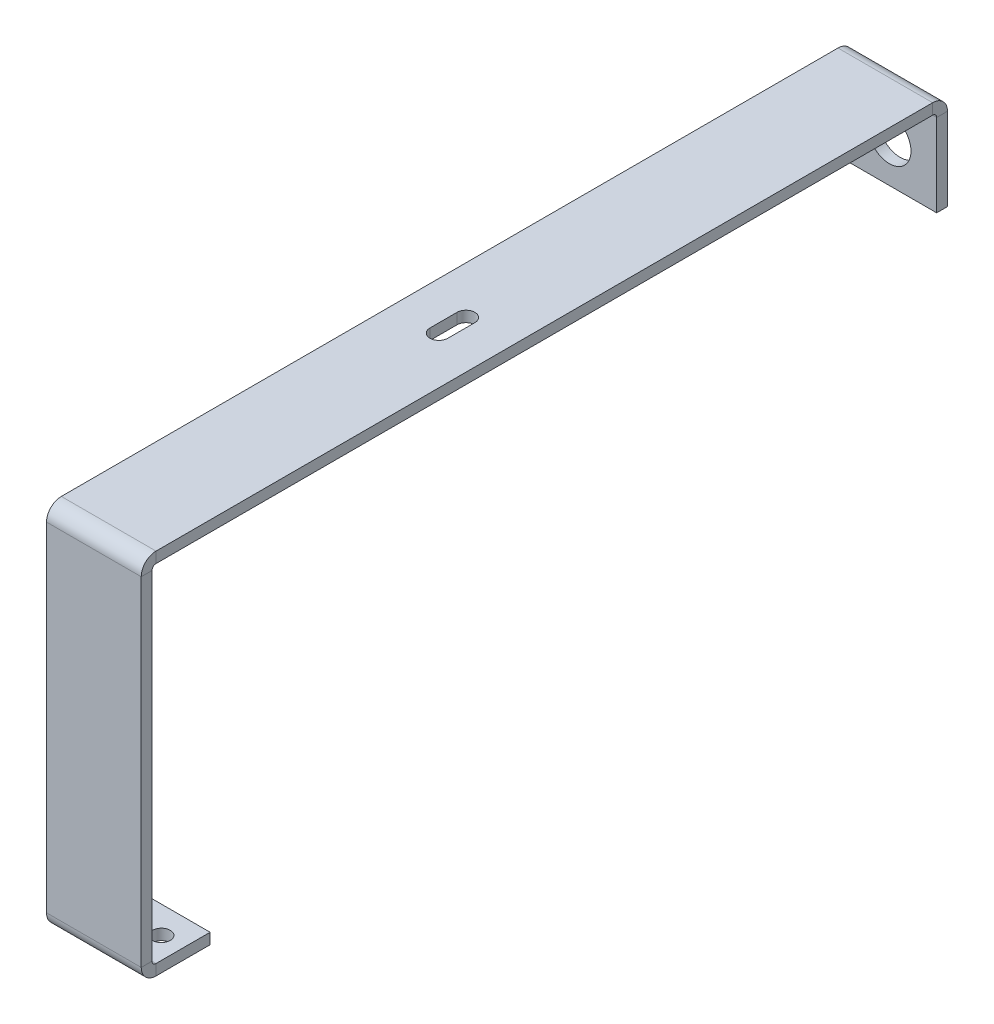
ISO-10303-21;
HEADER;
FILE_DESCRIPTION(('STEP AP214'),'2;1');
FILE_NAME('part.step','',(''),(''),'','','');
FILE_SCHEMA(('AUTOMOTIVE_DESIGN { 1 0 10303 214 1 1 1 1 }'));
ENDSEC;
DATA;
#1=APPLICATION_CONTEXT('core data for automotive mechanical design processes');
#2=APPLICATION_PROTOCOL_DEFINITION('international standard','automotive_design',2000,#1);
#3=PRODUCT_CONTEXT('',#1,'mechanical');
#4=PRODUCT('Part','Part','',(#3));
#5=PRODUCT_RELATED_PRODUCT_CATEGORY('part','',(#4));
#6=PRODUCT_DEFINITION_FORMATION('','',#4);
#7=PRODUCT_DEFINITION_CONTEXT('part definition',#1,'design');
#8=PRODUCT_DEFINITION('design','',#6,#7);
#9=PRODUCT_DEFINITION_SHAPE('','',#8);
#10=(LENGTH_UNIT() NAMED_UNIT(*) SI_UNIT(.MILLI.,.METRE.));
#11=(NAMED_UNIT(*) PLANE_ANGLE_UNIT() SI_UNIT($,.RADIAN.));
#12=(NAMED_UNIT(*) SI_UNIT($,.STERADIAN.) SOLID_ANGLE_UNIT());
#13=UNCERTAINTY_MEASURE_WITH_UNIT(LENGTH_MEASURE(1.E-05),#10,'distance_accuracy_value','');
#14=(GEOMETRIC_REPRESENTATION_CONTEXT(3) GLOBAL_UNCERTAINTY_ASSIGNED_CONTEXT((#13)) GLOBAL_UNIT_ASSIGNED_CONTEXT((#10,
#11,#12)) REPRESENTATION_CONTEXT('',''));
#15=CARTESIAN_POINT('',(0.,0.,0.));
#16=DIRECTION('',(0.,0.,1.));
#17=DIRECTION('',(1.,0.,0.));
#18=AXIS2_PLACEMENT_3D('',#15,#16,#17);
#19=CARTESIAN_POINT('',(0.,2.,0.));
#20=DIRECTION('',(0.,1.,0.));
#21=DIRECTION('',(0.,0.,1.));
#22=AXIS2_PLACEMENT_3D('',#19,#20,#21);
#23=PLANE('',#22);
#24=CARTESIAN_POINT('',(-4.75,2.,0.));
#25=DIRECTION('',(0.,1.,0.));
#26=DIRECTION('',(0.,0.,1.));
#27=AXIS2_PLACEMENT_3D('',#24,#25,#26);
#28=CIRCLE('',#27,1.63195);
#29=CARTESIAN_POINT('',(-4.75,2.,1.63195));
#30=VERTEX_POINT('',#29);
#31=EDGE_CURVE('E274',#30,#30,#28,.F.);
#32=ORIENTED_EDGE('',*,*,#31,.T.);
#33=EDGE_LOOP('',(#32));
#34=FACE_BOUND('',#33,.T.);
#35=DIRECTION('',(0.,0.,-1.));
#36=VECTOR('',#35,1.);
#37=CARTESIAN_POINT('',(8.75,2.,-5.));
#38=LINE('',#37,#36);
#39=CARTESIAN_POINT('',(8.75,2.,5.));
#40=VERTEX_POINT('',#39);
#41=CARTESIAN_POINT('',(8.75,2.,-5.));
#42=VERTEX_POINT('',#41);
#43=EDGE_CURVE('E418',#40,#42,#38,.T.);
#44=ORIENTED_EDGE('',*,*,#43,.T.);
#45=DIRECTION('',(-1.,0.,0.));
#46=VECTOR('',#45,1.);
#47=CARTESIAN_POINT('',(-8.75,2.,-5.));
#48=LINE('',#47,#46);
#49=CARTESIAN_POINT('',(-8.75,2.,-5.));
#50=VERTEX_POINT('',#49);
#51=EDGE_CURVE('E421',#42,#50,#48,.T.);
#52=ORIENTED_EDGE('',*,*,#51,.T.);
#53=DIRECTION('',(0.,0.,1.));
#54=VECTOR('',#53,1.);
#55=CARTESIAN_POINT('',(-8.75,2.,-5.));
#56=LINE('',#55,#54);
#57=CARTESIAN_POINT('',(-8.75,2.,5.));
#58=VERTEX_POINT('',#57);
#59=EDGE_CURVE('E424',#50,#58,#56,.T.);
#60=ORIENTED_EDGE('',*,*,#59,.T.);
#61=DIRECTION('',(1.,0.,0.));
#62=VECTOR('',#61,1.);
#63=CARTESIAN_POINT('',(-8.75,2.,5.));
#64=LINE('',#63,#62);
#65=EDGE_CURVE('E426',#58,#40,#64,.T.);
#66=ORIENTED_EDGE('',*,*,#65,.T.);
#67=EDGE_LOOP('',(#44,#52,#60,#66));
#68=FACE_BOUND('',#67,.T.);
#69=CARTESIAN_POINT('',(4.75,2.,0.));
#70=DIRECTION('',(0.,1.,0.));
#71=DIRECTION('',(0.,0.,1.));
#72=AXIS2_PLACEMENT_3D('',#69,#70,#71);
#73=CIRCLE('',#72,1.63195);
#74=CARTESIAN_POINT('',(4.75,2.,1.63195));
#75=VERTEX_POINT('',#74);
#76=EDGE_CURVE('E280',#75,#75,#73,.F.);
#77=ORIENTED_EDGE('',*,*,#76,.T.);
#78=EDGE_LOOP('',(#77));
#79=FACE_BOUND('',#78,.T.);
#80=ADVANCED_FACE('F103',(#34,#68,#79),#23,.T.);
#81=CARTESIAN_POINT('',(0.,0.,0.));
#82=DIRECTION('',(0.,1.,0.));
#83=DIRECTION('',(0.,0.,1.));
#84=AXIS2_PLACEMENT_3D('',#81,#82,#83);
#85=PLANE('',#84);
#86=CARTESIAN_POINT('',(-4.75,0.,0.));
#87=DIRECTION('',(0.,-1.,0.));
#88=DIRECTION('',(0.,0.,-1.));
#89=AXIS2_PLACEMENT_3D('',#86,#87,#88);
#90=CIRCLE('',#89,1.63195);
#91=CARTESIAN_POINT('',(-4.75,0.,-1.63195));
#92=VERTEX_POINT('',#91);
#93=EDGE_CURVE('E270',#92,#92,#90,.T.);
#94=ORIENTED_EDGE('',*,*,#93,.F.);
#95=EDGE_LOOP('',(#94));
#96=FACE_BOUND('',#95,.T.);
#97=DIRECTION('',(0.,0.,-1.));
#98=VECTOR('',#97,1.);
#99=CARTESIAN_POINT('',(8.75,0.,-5.));
#100=LINE('',#99,#98);
#101=CARTESIAN_POINT('',(8.74999999999999,0.,5.));
#102=VERTEX_POINT('',#101);
#103=CARTESIAN_POINT('',(8.75,0.,-5.));
#104=VERTEX_POINT('',#103);
#105=EDGE_CURVE('E409',#102,#104,#100,.T.);
#106=ORIENTED_EDGE('',*,*,#105,.F.);
#107=DIRECTION('',(1.,0.,0.));
#108=VECTOR('',#107,1.);
#109=CARTESIAN_POINT('',(-8.75,0.,5.));
#110=LINE('',#109,#108);
#111=CARTESIAN_POINT('',(-8.75,0.,5.));
#112=VERTEX_POINT('',#111);
#113=EDGE_CURVE('E422',#112,#102,#110,.T.);
#114=ORIENTED_EDGE('',*,*,#113,.F.);
#115=DIRECTION('',(0.,0.,1.));
#116=VECTOR('',#115,1.);
#117=CARTESIAN_POINT('',(-8.75,0.,-5.));
#118=LINE('',#117,#116);
#119=CARTESIAN_POINT('',(-8.75,0.,-5.));
#120=VERTEX_POINT('',#119);
#121=EDGE_CURVE('E433',#120,#112,#118,.T.);
#122=ORIENTED_EDGE('',*,*,#121,.F.);
#123=DIRECTION('',(-1.,0.,0.));
#124=VECTOR('',#123,1.);
#125=CARTESIAN_POINT('',(-8.75,0.,-5.));
#126=LINE('',#125,#124);
#127=EDGE_CURVE('E431',#104,#120,#126,.T.);
#128=ORIENTED_EDGE('',*,*,#127,.F.);
#129=EDGE_LOOP('',(#106,#114,#122,#128));
#130=FACE_BOUND('',#129,.T.);
#131=CARTESIAN_POINT('',(4.75,0.,0.));
#132=DIRECTION('',(0.,-1.,0.));
#133=DIRECTION('',(0.,0.,-1.));
#134=AXIS2_PLACEMENT_3D('',#131,#132,#133);
#135=CIRCLE('',#134,1.63195);
#136=CARTESIAN_POINT('',(4.75,0.,-1.63195));
#137=VERTEX_POINT('',#136);
#138=EDGE_CURVE('E277',#137,#137,#135,.T.);
#139=ORIENTED_EDGE('',*,*,#138,.F.);
#140=EDGE_LOOP('',(#139));
#141=FACE_BOUND('',#140,.T.);
#142=ADVANCED_FACE('F451',(#96,#130,#141),#85,.F.);
#143=CARTESIAN_POINT('',(8.74999999999997,68.0000000000005,-141.2634));
#144=DIRECTION('',(-1.,0.,0.));
#145=DIRECTION('',(0.,0.,1.));
#146=AXIS2_PLACEMENT_3D('',#143,#144,#145);
#147=PLANE('',#146);
#148=DIRECTION('',(0.,1.,0.));
#149=VECTOR('',#148,1.);
#150=CARTESIAN_POINT('',(8.74999999999999,66.0000000000005,-138.5268));
#151=LINE('',#150,#149);
#152=CARTESIAN_POINT('',(8.74999999999997,66.0000000000005,-138.5268));
#153=VERTEX_POINT('',#152);
#154=CARTESIAN_POINT('',(8.74999999999999,68.0000000000005,-138.5268));
#155=VERTEX_POINT('',#154);
#156=EDGE_CURVE('E326',#153,#155,#151,.T.);
#157=ORIENTED_EDGE('',*,*,#156,.T.);
#158=DIRECTION('',(0.,0.,-1.));
#159=VECTOR('',#158,1.);
#160=CARTESIAN_POINT('',(8.74999999999999,68.,2.43374438799444E-13));
#161=LINE('',#160,#159);
#162=CARTESIAN_POINT('',(8.74999999999998,68.,5.));
#163=VERTEX_POINT('',#162);
#164=EDGE_CURVE('E346',#163,#155,#161,.T.);
#165=ORIENTED_EDGE('',*,*,#164,.F.);
#166=DIRECTION('',(0.,-1.,0.));
#167=VECTOR('',#166,1.);
#168=CARTESIAN_POINT('',(8.74999999999998,66.,4.99999999999999));
#169=LINE('',#168,#167);
#170=CARTESIAN_POINT('',(8.74999999999998,66.,4.99999999999999));
#171=VERTEX_POINT('',#170);
#172=EDGE_CURVE('E356',#171,#163,#169,.F.);
#173=ORIENTED_EDGE('',*,*,#172,.F.);
#174=DIRECTION('',(0.,0.,1.));
#175=VECTOR('',#174,1.);
#176=CARTESIAN_POINT('',(8.74999999999997,66.0000000000005,-141.2634));
#177=LINE('',#176,#175);
#178=EDGE_CURVE('E350',#171,#153,#177,.F.);
#179=ORIENTED_EDGE('',*,*,#178,.T.);
#180=EDGE_LOOP('',(#157,#165,#173,#179));
#181=FACE_BOUND('',#180,.T.);
#182=ADVANCED_FACE('F486',(#181),#147,.F.);
#183=CARTESIAN_POINT('',(-8.75000000000002,68.,5.7366));
#184=DIRECTION('',(1.,0.,0.));
#185=DIRECTION('',(0.,0.,-1.));
#186=AXIS2_PLACEMENT_3D('',#183,#184,#185);
#187=PLANE('',#186);
#188=DIRECTION('',(0.,1.,0.));
#189=VECTOR('',#188,1.);
#190=CARTESIAN_POINT('',(-8.75,66.0000000000005,-138.5268));
#191=LINE('',#190,#189);
#192=CARTESIAN_POINT('',(-8.75,66.0000000000005,-138.5268));
#193=VERTEX_POINT('',#192);
#194=CARTESIAN_POINT('',(-8.75,68.0000000000005,-138.5268));
#195=VERTEX_POINT('',#194);
#196=EDGE_CURVE('E337',#193,#195,#191,.T.);
#197=ORIENTED_EDGE('',*,*,#196,.F.);
#198=DIRECTION('',(0.,0.,-1.));
#199=VECTOR('',#198,1.);
#200=CARTESIAN_POINT('',(-8.75000000000002,66.,5.7366));
#201=LINE('',#200,#199);
#202=CARTESIAN_POINT('',(-8.75000000000002,66.,4.99999999999999));
#203=VERTEX_POINT('',#202);
#204=EDGE_CURVE('E348',#193,#203,#201,.F.);
#205=ORIENTED_EDGE('',*,*,#204,.T.);
#206=DIRECTION('',(0.,-1.,0.));
#207=VECTOR('',#206,1.);
#208=CARTESIAN_POINT('',(-8.75000000000002,68.,5.));
#209=LINE('',#208,#207);
#210=CARTESIAN_POINT('',(-8.75000000000002,68.,5.));
#211=VERTEX_POINT('',#210);
#212=EDGE_CURVE('E340',#203,#211,#209,.F.);
#213=ORIENTED_EDGE('',*,*,#212,.T.);
#214=DIRECTION('',(0.,0.,1.));
#215=VECTOR('',#214,1.);
#216=CARTESIAN_POINT('',(-8.75000000000002,68.,2.4451026964681E-13));
#217=LINE('',#216,#215);
#218=EDGE_CURVE('E343',#195,#211,#217,.T.);
#219=ORIENTED_EDGE('',*,*,#218,.F.);
#220=EDGE_LOOP('',(#197,#205,#213,#219));
#221=FACE_BOUND('',#220,.T.);
#222=ADVANCED_FACE('F573',(#221),#187,.F.);
#223=CARTESIAN_POINT('',(0.,68.,2.4451026964681E-13));
#224=DIRECTION('',(0.,-1.,0.));
#225=DIRECTION('',(0.,0.,-1.));
#226=AXIS2_PLACEMENT_3D('',#223,#224,#225);
#227=PLANE('',#226);
#228=DIRECTION('',(0.,0.,1.));
#229=VECTOR('',#228,1.);
#230=CARTESIAN_POINT('',(-1.65,68.0000000000002,-61.0268));
#231=LINE('',#230,#229);
#232=CARTESIAN_POINT('',(-1.65,68.0000000000002,-61.0268));
#233=VERTEX_POINT('',#232);
#234=CARTESIAN_POINT('',(-1.65,68.0000000000002,-56.0267999999999));
#235=VERTEX_POINT('',#234);
#236=EDGE_CURVE('E826',#233,#235,#231,.T.);
#237=ORIENTED_EDGE('',*,*,#236,.F.);
#238=CARTESIAN_POINT('',(0.,68.0000000000002,-61.0268));
#239=DIRECTION('',(0.,-1.,0.));
#240=DIRECTION('',(0.,0.,-1.));
#241=AXIS2_PLACEMENT_3D('',#238,#239,#240);
#242=CIRCLE('',#241,1.65);
#243=CARTESIAN_POINT('',(1.65,68.0000000000002,-61.0268));
#244=VERTEX_POINT('',#243);
#245=EDGE_CURVE('E271',#244,#233,#242,.F.);
#246=ORIENTED_EDGE('',*,*,#245,.F.);
#247=DIRECTION('',(0.,0.,-1.));
#248=VECTOR('',#247,1.);
#249=CARTESIAN_POINT('',(1.65,68.0000000000002,-61.0268));
#250=LINE('',#249,#248);
#251=CARTESIAN_POINT('',(1.65,68.0000000000002,-56.0268));
#252=VERTEX_POINT('',#251);
#253=EDGE_CURVE('E268',#252,#244,#250,.T.);
#254=ORIENTED_EDGE('',*,*,#253,.F.);
#255=CARTESIAN_POINT('',(0.,68.0000000000002,-56.0268));
#256=DIRECTION('',(0.,-1.,0.));
#257=DIRECTION('',(0.,0.,-1.));
#258=AXIS2_PLACEMENT_3D('',#255,#256,#257);
#259=CIRCLE('',#258,1.65);
#260=EDGE_CURVE('E246',#235,#252,#259,.F.);
#261=ORIENTED_EDGE('',*,*,#260,.F.);
#262=EDGE_LOOP('',(#237,#246,#254,#261));
#263=FACE_BOUND('',#262,.T.);
#264=DIRECTION('',(1.,0.,0.));
#265=VECTOR('',#264,1.);
#266=CARTESIAN_POINT('',(8.75,68.0000000000005,-138.5268));
#267=LINE('',#266,#265);
#268=EDGE_CURVE('E320',#155,#195,#267,.F.);
#269=ORIENTED_EDGE('',*,*,#268,.T.);
#270=ORIENTED_EDGE('',*,*,#218,.T.);
#271=DIRECTION('',(1.,0.,0.));
#272=VECTOR('',#271,1.);
#273=CARTESIAN_POINT('',(-8.75000000000002,68.,5.));
#274=LINE('',#273,#272);
#275=EDGE_CURVE('E353',#163,#211,#274,.F.);
#276=ORIENTED_EDGE('',*,*,#275,.F.);
#277=ORIENTED_EDGE('',*,*,#164,.T.);
#278=EDGE_LOOP('',(#269,#270,#276,#277));
#279=FACE_BOUND('',#278,.T.);
#280=ADVANCED_FACE('F484',(#263,#279),#227,.F.);
#281=CARTESIAN_POINT('',(0.,66.,2.37527306969124E-13));
#282=DIRECTION('',(0.,-1.,0.));
#283=DIRECTION('',(0.,0.,-1.));
#284=AXIS2_PLACEMENT_3D('',#281,#282,#283);
#285=PLANE('',#284);
#286=CARTESIAN_POINT('',(0.,66.0000000000002,-61.0268));
#287=DIRECTION('',(0.,-1.,0.));
#288=DIRECTION('',(0.,0.,-1.));
#289=AXIS2_PLACEMENT_3D('',#286,#287,#288);
#290=CIRCLE('',#289,1.65);
#291=CARTESIAN_POINT('',(-1.65,66.0000000000002,-61.0268));
#292=VERTEX_POINT('',#291);
#293=CARTESIAN_POINT('',(1.65,66.0000000000002,-61.0268));
#294=VERTEX_POINT('',#293);
#295=EDGE_CURVE('E126',#292,#294,#290,.T.);
#296=ORIENTED_EDGE('',*,*,#295,.F.);
#297=DIRECTION('',(0.,0.,-1.));
#298=VECTOR('',#297,1.);
#299=CARTESIAN_POINT('',(-1.65,66.0000000000002,-61.0268));
#300=LINE('',#299,#298);
#301=CARTESIAN_POINT('',(-1.65,66.0000000000002,-56.0268));
#302=VERTEX_POINT('',#301);
#303=EDGE_CURVE('E259',#302,#292,#300,.T.);
#304=ORIENTED_EDGE('',*,*,#303,.F.);
#305=CARTESIAN_POINT('',(0.,66.0000000000002,-56.0268));
#306=DIRECTION('',(0.,-1.,0.));
#307=DIRECTION('',(0.,0.,-1.));
#308=AXIS2_PLACEMENT_3D('',#305,#306,#307);
#309=CIRCLE('',#308,1.65);
#310=CARTESIAN_POINT('',(1.65,66.0000000000002,-56.0268));
#311=VERTEX_POINT('',#310);
#312=EDGE_CURVE('E243',#311,#302,#309,.T.);
#313=ORIENTED_EDGE('',*,*,#312,.F.);
#314=DIRECTION('',(0.,0.,1.));
#315=VECTOR('',#314,1.);
#316=CARTESIAN_POINT('',(1.65,66.0000000000002,-61.0268));
#317=LINE('',#316,#315);
#318=EDGE_CURVE('E252',#294,#311,#317,.T.);
#319=ORIENTED_EDGE('',*,*,#318,.F.);
#320=EDGE_LOOP('',(#296,#304,#313,#319));
#321=FACE_BOUND('',#320,.T.);
#322=ORIENTED_EDGE('',*,*,#204,.F.);
#323=DIRECTION('',(1.,0.,0.));
#324=VECTOR('',#323,1.);
#325=CARTESIAN_POINT('',(8.75,66.0000000000005,-138.5268));
#326=LINE('',#325,#324);
#327=EDGE_CURVE('E332',#153,#193,#326,.F.);
#328=ORIENTED_EDGE('',*,*,#327,.F.);
#329=ORIENTED_EDGE('',*,*,#178,.F.);
#330=DIRECTION('',(1.,0.,0.));
#331=VECTOR('',#330,1.);
#332=CARTESIAN_POINT('',(-8.75000000000002,66.,4.99999999999999));
#333=LINE('',#332,#331);
#334=EDGE_CURVE('E359',#203,#171,#333,.T.);
#335=ORIENTED_EDGE('',*,*,#334,.F.);
#336=EDGE_LOOP('',(#322,#328,#329,#335));
#337=FACE_BOUND('',#336,.T.);
#338=ADVANCED_FACE('F256',(#321,#337),#285,.T.);
#339=CARTESIAN_POINT('',(8.74999999999999,68.,7.7366));
#340=DIRECTION('',(-1.,0.,0.));
#341=DIRECTION('',(0.,-1.,0.));
#342=AXIS2_PLACEMENT_3D('',#339,#340,#341);
#343=PLANE('',#342);
#344=DIRECTION('',(0.,0.,1.));
#345=VECTOR('',#344,1.);
#346=CARTESIAN_POINT('',(8.74999999999998,65.2634,5.73659999999999));
#347=LINE('',#346,#345);
#348=CARTESIAN_POINT('',(8.74999999999999,65.2634,5.7366));
#349=VERTEX_POINT('',#348);
#350=CARTESIAN_POINT('',(8.74999999999998,65.2634,7.73659999999999));
#351=VERTEX_POINT('',#350);
#352=EDGE_CURVE('E369',#349,#351,#347,.T.);
#353=ORIENTED_EDGE('',*,*,#352,.T.);
#354=DIRECTION('',(0.,1.,0.));
#355=VECTOR('',#354,1.);
#356=CARTESIAN_POINT('',(8.74999999999999,0.,7.7366));
#357=LINE('',#356,#355);
#358=CARTESIAN_POINT('',(8.74999999999999,2.7366,7.7366));
#359=VERTEX_POINT('',#358);
#360=EDGE_CURVE('E389',#359,#351,#357,.T.);
#361=ORIENTED_EDGE('',*,*,#360,.F.);
#362=DIRECTION('',(0.,0.,-1.));
#363=VECTOR('',#362,1.);
#364=CARTESIAN_POINT('',(8.74999999999999,2.7366,5.7366));
#365=LINE('',#364,#363);
#366=CARTESIAN_POINT('',(8.74999999999999,2.7366,5.7366));
#367=VERTEX_POINT('',#366);
#368=EDGE_CURVE('E399',#367,#359,#365,.F.);
#369=ORIENTED_EDGE('',*,*,#368,.F.);
#370=DIRECTION('',(0.,-1.,0.));
#371=VECTOR('',#370,1.);
#372=CARTESIAN_POINT('',(8.74999999999999,68.,5.7366));
#373=LINE('',#372,#371);
#374=EDGE_CURVE('E393',#367,#349,#373,.F.);
#375=ORIENTED_EDGE('',*,*,#374,.T.);
#376=EDGE_LOOP('',(#353,#361,#369,#375));
#377=FACE_BOUND('',#376,.T.);
#378=ADVANCED_FACE('F468',(#377),#343,.F.);
#379=CARTESIAN_POINT('',(-8.74999999999999,2.,7.7366));
#380=DIRECTION('',(1.,0.,0.));
#381=DIRECTION('',(0.,1.,0.));
#382=AXIS2_PLACEMENT_3D('',#379,#380,#381);
#383=PLANE('',#382);
#384=DIRECTION('',(0.,0.,1.));
#385=VECTOR('',#384,1.);
#386=CARTESIAN_POINT('',(-8.75000000000002,65.2634,5.73659999999999));
#387=LINE('',#386,#385);
#388=CARTESIAN_POINT('',(-8.75000000000002,65.2634,5.73659999999999));
#389=VERTEX_POINT('',#388);
#390=CARTESIAN_POINT('',(-8.75000000000002,65.2634,7.7366));
#391=VERTEX_POINT('',#390);
#392=EDGE_CURVE('E380',#389,#391,#387,.T.);
#393=ORIENTED_EDGE('',*,*,#392,.F.);
#394=DIRECTION('',(0.,1.,0.));
#395=VECTOR('',#394,1.);
#396=CARTESIAN_POINT('',(-8.74999999999999,2.,5.7366));
#397=LINE('',#396,#395);
#398=CARTESIAN_POINT('',(-8.74999999999998,2.7366,5.7366));
#399=VERTEX_POINT('',#398);
#400=EDGE_CURVE('E391',#389,#399,#397,.F.);
#401=ORIENTED_EDGE('',*,*,#400,.T.);
#402=DIRECTION('',(0.,0.,-1.));
#403=VECTOR('',#402,1.);
#404=CARTESIAN_POINT('',(-8.74999999999999,2.7366,7.7366));
#405=LINE('',#404,#403);
#406=CARTESIAN_POINT('',(-8.74999999999998,2.7366,7.7366));
#407=VERTEX_POINT('',#406);
#408=EDGE_CURVE('E383',#399,#407,#405,.F.);
#409=ORIENTED_EDGE('',*,*,#408,.T.);
#410=DIRECTION('',(0.,-1.,0.));
#411=VECTOR('',#410,1.);
#412=CARTESIAN_POINT('',(-8.74999999999999,0.,7.7366));
#413=LINE('',#412,#411);
#414=EDGE_CURVE('E386',#391,#407,#413,.T.);
#415=ORIENTED_EDGE('',*,*,#414,.F.);
#416=EDGE_LOOP('',(#393,#401,#409,#415));
#417=FACE_BOUND('',#416,.T.);
#418=ADVANCED_FACE('F582',(#417),#383,.F.);
#419=CARTESIAN_POINT('',(0.,0.,7.7366));
#420=DIRECTION('',(0.,0.,-1.));
#421=DIRECTION('',(-1.,0.,0.));
#422=AXIS2_PLACEMENT_3D('',#419,#420,#421);
#423=PLANE('',#422);
#424=DIRECTION('',(1.,0.,0.));
#425=VECTOR('',#424,1.);
#426=CARTESIAN_POINT('',(8.74999999999999,65.2634,7.73659999999999));
#427=LINE('',#426,#425);
#428=EDGE_CURVE('E363',#351,#391,#427,.F.);
#429=ORIENTED_EDGE('',*,*,#428,.T.);
#430=ORIENTED_EDGE('',*,*,#414,.T.);
#431=DIRECTION('',(1.,0.,0.));
#432=VECTOR('',#431,1.);
#433=CARTESIAN_POINT('',(-8.75,2.7366,7.7366));
#434=LINE('',#433,#432);
#435=EDGE_CURVE('E396',#359,#407,#434,.F.);
#436=ORIENTED_EDGE('',*,*,#435,.F.);
#437=ORIENTED_EDGE('',*,*,#360,.T.);
#438=EDGE_LOOP('',(#429,#430,#436,#437));
#439=FACE_BOUND('',#438,.T.);
#440=ADVANCED_FACE('F464',(#439),#423,.F.);
#441=CARTESIAN_POINT('',(0.,0.,5.7366));
#442=DIRECTION('',(0.,0.,-1.));
#443=DIRECTION('',(-1.,0.,0.));
#444=AXIS2_PLACEMENT_3D('',#441,#442,#443);
#445=PLANE('',#444);
#446=ORIENTED_EDGE('',*,*,#400,.F.);
#447=DIRECTION('',(1.,0.,0.));
#448=VECTOR('',#447,1.);
#449=CARTESIAN_POINT('',(8.74999999999999,65.2634,5.73659999999999));
#450=LINE('',#449,#448);
#451=EDGE_CURVE('E375',#349,#389,#450,.F.);
#452=ORIENTED_EDGE('',*,*,#451,.F.);
#453=ORIENTED_EDGE('',*,*,#374,.F.);
#454=DIRECTION('',(1.,0.,0.));
#455=VECTOR('',#454,1.);
#456=CARTESIAN_POINT('',(-8.75,2.7366,5.7366));
#457=LINE('',#456,#455);
#458=EDGE_CURVE('E402',#399,#367,#457,.T.);
#459=ORIENTED_EDGE('',*,*,#458,.F.);
#460=EDGE_LOOP('',(#446,#452,#453,#459));
#461=FACE_BOUND('',#460,.T.);
#462=ADVANCED_FACE('F553',(#461),#445,.T.);
#463=CARTESIAN_POINT('',(8.75,2.,-5.));
#464=DIRECTION('',(-1.,0.,0.));
#465=DIRECTION('',(0.,0.,1.));
#466=AXIS2_PLACEMENT_3D('',#463,#464,#465);
#467=PLANE('',#466);
#468=ORIENTED_EDGE('',*,*,#105,.T.);
#469=DIRECTION('',(0.,-1.,0.));
#470=VECTOR('',#469,1.);
#471=CARTESIAN_POINT('',(8.75,2.,-5.));
#472=LINE('',#471,#470);
#473=EDGE_CURVE('E13',#42,#104,#472,.T.);
#474=ORIENTED_EDGE('',*,*,#473,.F.);
#475=ORIENTED_EDGE('',*,*,#43,.F.);
#476=DIRECTION('',(0.,-1.,0.));
#477=VECTOR('',#476,1.);
#478=CARTESIAN_POINT('',(8.75,2.,5.));
#479=LINE('',#478,#477);
#480=EDGE_CURVE('E428',#40,#102,#479,.T.);
#481=ORIENTED_EDGE('',*,*,#480,.T.);
#482=EDGE_LOOP('',(#468,#474,#475,#481));
#483=FACE_BOUND('',#482,.T.);
#484=ADVANCED_FACE('F105',(#483),#467,.F.);
#485=CARTESIAN_POINT('',(-8.75,2.,-5.));
#486=DIRECTION('',(0.,0.,1.));
#487=DIRECTION('',(1.,0.,0.));
#488=AXIS2_PLACEMENT_3D('',#485,#486,#487);
#489=PLANE('',#488);
#490=ORIENTED_EDGE('',*,*,#127,.T.);
#491=DIRECTION('',(0.,-1.,0.));
#492=VECTOR('',#491,1.);
#493=CARTESIAN_POINT('',(-8.75,2.,-5.));
#494=LINE('',#493,#492);
#495=EDGE_CURVE('E111',#50,#120,#494,.T.);
#496=ORIENTED_EDGE('',*,*,#495,.F.);
#497=ORIENTED_EDGE('',*,*,#51,.F.);
#498=ORIENTED_EDGE('',*,*,#473,.T.);
#499=EDGE_LOOP('',(#490,#496,#497,#498));
#500=FACE_BOUND('',#499,.T.);
#501=ADVANCED_FACE('F548',(#500),#489,.F.);
#502=CARTESIAN_POINT('',(-8.75,2.,-5.));
#503=DIRECTION('',(1.,0.,0.));
#504=DIRECTION('',(0.,0.,-1.));
#505=AXIS2_PLACEMENT_3D('',#502,#503,#504);
#506=PLANE('',#505);
#507=ORIENTED_EDGE('',*,*,#121,.T.);
#508=DIRECTION('',(0.,-1.,0.));
#509=VECTOR('',#508,1.);
#510=CARTESIAN_POINT('',(-8.75,2.,5.));
#511=LINE('',#510,#509);
#512=EDGE_CURVE('E439',#58,#112,#511,.T.);
#513=ORIENTED_EDGE('',*,*,#512,.F.);
#514=ORIENTED_EDGE('',*,*,#59,.F.);
#515=ORIENTED_EDGE('',*,*,#495,.T.);
#516=EDGE_LOOP('',(#507,#513,#514,#515));
#517=FACE_BOUND('',#516,.T.);
#518=ADVANCED_FACE('F446',(#517),#506,.F.);
#519=CARTESIAN_POINT('',(-8.74999999999999,2.7366,5.));
#520=DIRECTION('',(-1.,0.,0.));
#521=DIRECTION('',(0.,0.,1.));
#522=AXIS2_PLACEMENT_3D('',#519,#520,#521);
#523=PLANE('',#522);
#524=ORIENTED_EDGE('',*,*,#408,.F.);
#525=CARTESIAN_POINT('',(-8.74999999999999,2.7366,5.));
#526=DIRECTION('',(1.,0.,0.));
#527=DIRECTION('',(0.,0.,-1.));
#528=AXIS2_PLACEMENT_3D('',#525,#526,#527);
#529=CIRCLE('',#528,0.736599999999998);
#530=EDGE_CURVE('E413',#58,#399,#529,.F.);
#531=ORIENTED_EDGE('',*,*,#530,.F.);
#532=ORIENTED_EDGE('',*,*,#512,.T.);
#533=CARTESIAN_POINT('',(-8.74999999999998,2.7366,5.));
#534=DIRECTION('',(1.,0.,0.));
#535=DIRECTION('',(0.,0.,-1.));
#536=AXIS2_PLACEMENT_3D('',#533,#534,#535);
#537=CIRCLE('',#536,2.7366);
#538=EDGE_CURVE('E406',#112,#407,#537,.F.);
#539=ORIENTED_EDGE('',*,*,#538,.T.);
#540=EDGE_LOOP('',(#524,#531,#532,#539));
#541=FACE_BOUND('',#540,.T.);
#542=ADVANCED_FACE('F458',(#541),#523,.T.);
#543=CARTESIAN_POINT('',(8.74999999999999,2.7366,5.));
#544=DIRECTION('',(-1.,0.,0.));
#545=DIRECTION('',(0.,0.,1.));
#546=AXIS2_PLACEMENT_3D('',#543,#544,#545);
#547=PLANE('',#546);
#548=CARTESIAN_POINT('',(8.74999999999999,2.7366,5.));
#549=DIRECTION('',(1.,0.,0.));
#550=DIRECTION('',(0.,0.,-1.));
#551=AXIS2_PLACEMENT_3D('',#548,#549,#550);
#552=CIRCLE('',#551,0.736599999999998);
#553=EDGE_CURVE('E388',#367,#40,#552,.T.);
#554=ORIENTED_EDGE('',*,*,#553,.F.);
#555=ORIENTED_EDGE('',*,*,#368,.T.);
#556=CARTESIAN_POINT('',(8.74999999999999,2.7366,5.));
#557=DIRECTION('',(1.,0.,0.));
#558=DIRECTION('',(0.,0.,-1.));
#559=AXIS2_PLACEMENT_3D('',#556,#557,#558);
#560=CIRCLE('',#559,2.7366);
#561=EDGE_CURVE('E410',#359,#102,#560,.T.);
#562=ORIENTED_EDGE('',*,*,#561,.T.);
#563=ORIENTED_EDGE('',*,*,#480,.F.);
#564=EDGE_LOOP('',(#554,#555,#562,#563));
#565=FACE_BOUND('',#564,.T.);
#566=ADVANCED_FACE('F544',(#565),#547,.F.);
#567=CARTESIAN_POINT('',(8.74999999999999,2.7366,5.));
#568=DIRECTION('',(1.,0.,0.));
#569=DIRECTION('',(0.,0.,1.));
#570=AXIS2_PLACEMENT_3D('',#567,#568,#569);
#571=CYLINDRICAL_SURFACE('',#570,2.7366);
#572=ORIENTED_EDGE('',*,*,#113,.T.);
#573=ORIENTED_EDGE('',*,*,#561,.F.);
#574=ORIENTED_EDGE('',*,*,#435,.T.);
#575=ORIENTED_EDGE('',*,*,#538,.F.);
#576=EDGE_LOOP('',(#572,#573,#574,#575));
#577=FACE_BOUND('',#576,.T.);
#578=ADVANCED_FACE('F460',(#577),#571,.T.);
#579=CARTESIAN_POINT('',(8.74999999999999,2.7366,5.));
#580=DIRECTION('',(1.,0.,0.));
#581=DIRECTION('',(0.,0.,1.));
#582=AXIS2_PLACEMENT_3D('',#579,#580,#581);
#583=CYLINDRICAL_SURFACE('',#582,0.736599999999998);
#584=ORIENTED_EDGE('',*,*,#65,.F.);
#585=ORIENTED_EDGE('',*,*,#530,.T.);
#586=ORIENTED_EDGE('',*,*,#458,.T.);
#587=ORIENTED_EDGE('',*,*,#553,.T.);
#588=EDGE_LOOP('',(#584,#585,#586,#587));
#589=FACE_BOUND('',#588,.T.);
#590=ADVANCED_FACE('F561',(#589),#583,.F.);
#591=CARTESIAN_POINT('',(-8.75000000000002,65.2634,4.99999999999999));
#592=DIRECTION('',(-1.,0.,0.));
#593=DIRECTION('',(0.,0.,1.));
#594=AXIS2_PLACEMENT_3D('',#591,#592,#593);
#595=PLANE('',#594);
#596=ORIENTED_EDGE('',*,*,#212,.F.);
#597=CARTESIAN_POINT('',(-8.75000000000002,65.2634,4.99999999999999));
#598=DIRECTION('',(1.,0.,0.));
#599=DIRECTION('',(0.,0.,-1.));
#600=AXIS2_PLACEMENT_3D('',#597,#598,#599);
#601=CIRCLE('',#600,0.736600000000004);
#602=EDGE_CURVE('E372',#389,#203,#601,.F.);
#603=ORIENTED_EDGE('',*,*,#602,.F.);
#604=ORIENTED_EDGE('',*,*,#392,.T.);
#605=CARTESIAN_POINT('',(-8.75000000000002,65.2634,4.99999999999999));
#606=DIRECTION('',(1.,0.,0.));
#607=DIRECTION('',(0.,0.,-1.));
#608=AXIS2_PLACEMENT_3D('',#605,#606,#607);
#609=CIRCLE('',#608,2.7366);
#610=EDGE_CURVE('E365',#391,#211,#609,.F.);
#611=ORIENTED_EDGE('',*,*,#610,.T.);
#612=EDGE_LOOP('',(#596,#603,#604,#611));
#613=FACE_BOUND('',#612,.T.);
#614=ADVANCED_FACE('F571',(#613),#595,.T.);
#615=CARTESIAN_POINT('',(8.74999999999998,65.2634,4.99999999999999));
#616=DIRECTION('',(-1.,0.,0.));
#617=DIRECTION('',(0.,0.,1.));
#618=AXIS2_PLACEMENT_3D('',#615,#616,#617);
#619=PLANE('',#618);
#620=CARTESIAN_POINT('',(8.74999999999998,65.2634,4.99999999999999));
#621=DIRECTION('',(1.,0.,0.));
#622=DIRECTION('',(0.,0.,-1.));
#623=AXIS2_PLACEMENT_3D('',#620,#621,#622);
#624=CIRCLE('',#623,0.736600000000004);
#625=EDGE_CURVE('E345',#171,#349,#624,.T.);
#626=ORIENTED_EDGE('',*,*,#625,.F.);
#627=ORIENTED_EDGE('',*,*,#172,.T.);
#628=CARTESIAN_POINT('',(8.74999999999998,65.2634,4.99999999999999));
#629=DIRECTION('',(1.,0.,0.));
#630=DIRECTION('',(0.,0.,-1.));
#631=AXIS2_PLACEMENT_3D('',#628,#629,#630);
#632=CIRCLE('',#631,2.7366);
#633=EDGE_CURVE('E366',#163,#351,#632,.T.);
#634=ORIENTED_EDGE('',*,*,#633,.T.);
#635=ORIENTED_EDGE('',*,*,#352,.F.);
#636=EDGE_LOOP('',(#626,#627,#634,#635));
#637=FACE_BOUND('',#636,.T.);
#638=ADVANCED_FACE('F477',(#637),#619,.F.);
#639=CARTESIAN_POINT('',(8.74999999999999,65.2634,4.99999999999999));
#640=DIRECTION('',(1.,0.,0.));
#641=DIRECTION('',(0.,1.,0.));
#642=AXIS2_PLACEMENT_3D('',#639,#640,#641);
#643=CYLINDRICAL_SURFACE('',#642,2.7366);
#644=ORIENTED_EDGE('',*,*,#428,.F.);
#645=ORIENTED_EDGE('',*,*,#633,.F.);
#646=ORIENTED_EDGE('',*,*,#275,.T.);
#647=ORIENTED_EDGE('',*,*,#610,.F.);
#648=EDGE_LOOP('',(#644,#645,#646,#647));
#649=FACE_BOUND('',#648,.T.);
#650=ADVANCED_FACE('F476',(#649),#643,.T.);
#651=CARTESIAN_POINT('',(8.74999999999999,65.2634,4.99999999999999));
#652=DIRECTION('',(1.,0.,0.));
#653=DIRECTION('',(0.,1.,0.));
#654=AXIS2_PLACEMENT_3D('',#651,#652,#653);
#655=CYLINDRICAL_SURFACE('',#654,0.736600000000004);
#656=ORIENTED_EDGE('',*,*,#451,.T.);
#657=ORIENTED_EDGE('',*,*,#602,.T.);
#658=ORIENTED_EDGE('',*,*,#334,.T.);
#659=ORIENTED_EDGE('',*,*,#625,.T.);
#660=EDGE_LOOP('',(#656,#657,#658,#659));
#661=FACE_BOUND('',#660,.T.);
#662=ADVANCED_FACE('F567',(#661),#655,.F.);
#663=CARTESIAN_POINT('',(-8.75,65.2634000000005,-138.5268));
#664=DIRECTION('',(-1.,0.,0.));
#665=DIRECTION('',(0.,0.,1.));
#666=AXIS2_PLACEMENT_3D('',#663,#664,#665);
#667=PLANE('',#666);
#668=DIRECTION('',(0.,0.,1.));
#669=VECTOR('',#668,1.);
#670=CARTESIAN_POINT('',(-8.75,65.2634000000005,-141.2634));
#671=LINE('',#670,#669);
#672=CARTESIAN_POINT('',(-8.75,65.2634000000005,-139.2634));
#673=VERTEX_POINT('',#672);
#674=CARTESIAN_POINT('',(-8.75,65.2634000000005,-141.2634));
#675=VERTEX_POINT('',#674);
#676=EDGE_CURVE('E289',#673,#675,#671,.F.);
#677=ORIENTED_EDGE('',*,*,#676,.F.);
#678=CARTESIAN_POINT('',(-8.75,65.2634000000005,-138.5268));
#679=DIRECTION('',(1.,0.,0.));
#680=DIRECTION('',(0.,0.,-1.));
#681=AXIS2_PLACEMENT_3D('',#678,#679,#680);
#682=CIRCLE('',#681,0.736600000000004);
#683=EDGE_CURVE('E329',#193,#673,#682,.F.);
#684=ORIENTED_EDGE('',*,*,#683,.F.);
#685=ORIENTED_EDGE('',*,*,#196,.T.);
#686=CARTESIAN_POINT('',(-8.75,65.2634000000005,-138.5268));
#687=DIRECTION('',(1.,0.,0.));
#688=DIRECTION('',(0.,0.,-1.));
#689=AXIS2_PLACEMENT_3D('',#686,#687,#688);
#690=CIRCLE('',#689,2.7366);
#691=EDGE_CURVE('E322',#195,#675,#690,.F.);
#692=ORIENTED_EDGE('',*,*,#691,.T.);
#693=EDGE_LOOP('',(#677,#684,#685,#692));
#694=FACE_BOUND('',#693,.T.);
#695=ADVANCED_FACE('F515',(#694),#667,.T.);
#696=CARTESIAN_POINT('',(8.74999999999999,65.2634000000005,-138.5268));
#697=DIRECTION('',(-1.,0.,0.));
#698=DIRECTION('',(0.,0.,1.));
#699=AXIS2_PLACEMENT_3D('',#696,#697,#698);
#700=PLANE('',#699);
#701=CARTESIAN_POINT('',(8.74999999999999,65.2634000000005,-138.5268));
#702=DIRECTION('',(1.,0.,0.));
#703=DIRECTION('',(0.,0.,-1.));
#704=AXIS2_PLACEMENT_3D('',#701,#702,#703);
#705=CIRCLE('',#704,0.736600000000004);
#706=CARTESIAN_POINT('',(8.74999999999999,65.2634000000005,-139.2634));
#707=VERTEX_POINT('',#706);
#708=EDGE_CURVE('E293',#707,#153,#705,.T.);
#709=ORIENTED_EDGE('',*,*,#708,.F.);
#710=DIRECTION('',(0.,0.,1.));
#711=VECTOR('',#710,1.);
#712=CARTESIAN_POINT('',(8.74999999999999,65.2634000000005,-139.2634));
#713=LINE('',#712,#711);
#714=CARTESIAN_POINT('',(8.75,65.2634000000005,-141.2634));
#715=VERTEX_POINT('',#714);
#716=EDGE_CURVE('E313',#707,#715,#713,.F.);
#717=ORIENTED_EDGE('',*,*,#716,.T.);
#718=CARTESIAN_POINT('',(8.74999999999999,65.2634000000005,-138.5268));
#719=DIRECTION('',(1.,0.,0.));
#720=DIRECTION('',(0.,0.,-1.));
#721=AXIS2_PLACEMENT_3D('',#718,#719,#720);
#722=CIRCLE('',#721,2.7366);
#723=EDGE_CURVE('E323',#715,#155,#722,.T.);
#724=ORIENTED_EDGE('',*,*,#723,.T.);
#725=ORIENTED_EDGE('',*,*,#156,.F.);
#726=EDGE_LOOP('',(#709,#717,#724,#725));
#727=FACE_BOUND('',#726,.T.);
#728=ADVANCED_FACE('F494',(#727),#700,.F.);
#729=CARTESIAN_POINT('',(8.75,65.2634000000005,-138.5268));
#730=DIRECTION('',(1.,0.,0.));
#731=DIRECTION('',(0.,0.,-1.));
#732=AXIS2_PLACEMENT_3D('',#729,#730,#731);
#733=CYLINDRICAL_SURFACE('',#732,2.7366);
#734=ORIENTED_EDGE('',*,*,#268,.F.);
#735=ORIENTED_EDGE('',*,*,#723,.F.);
#736=DIRECTION('',(1.,0.,0.));
#737=VECTOR('',#736,1.);
#738=CARTESIAN_POINT('',(-8.75,65.2634000000005,-141.2634));
#739=LINE('',#738,#737);
#740=EDGE_CURVE('E311',#715,#675,#739,.F.);
#741=ORIENTED_EDGE('',*,*,#740,.T.);
#742=ORIENTED_EDGE('',*,*,#691,.F.);
#743=EDGE_LOOP('',(#734,#735,#741,#742));
#744=FACE_BOUND('',#743,.T.);
#745=ADVANCED_FACE('F493',(#744),#733,.T.);
#746=CARTESIAN_POINT('',(8.75,65.2634000000005,-138.5268));
#747=DIRECTION('',(1.,0.,0.));
#748=DIRECTION('',(0.,0.,-1.));
#749=AXIS2_PLACEMENT_3D('',#746,#747,#748);
#750=CYLINDRICAL_SURFACE('',#749,0.736600000000004);
#751=ORIENTED_EDGE('',*,*,#327,.T.);
#752=ORIENTED_EDGE('',*,*,#683,.T.);
#753=DIRECTION('',(1.,0.,0.));
#754=VECTOR('',#753,1.);
#755=CARTESIAN_POINT('',(-8.75,65.2634000000005,-139.2634));
#756=LINE('',#755,#754);
#757=EDGE_CURVE('E316',#673,#707,#756,.T.);
#758=ORIENTED_EDGE('',*,*,#757,.T.);
#759=ORIENTED_EDGE('',*,*,#708,.T.);
#760=EDGE_LOOP('',(#751,#752,#758,#759));
#761=FACE_BOUND('',#760,.T.);
#762=ADVANCED_FACE('F518',(#761),#750,.F.);
#763=CARTESIAN_POINT('',(8.75,50.0000000000005,-141.2634));
#764=DIRECTION('',(-1.,0.,0.));
#765=DIRECTION('',(0.,-1.,0.));
#766=AXIS2_PLACEMENT_3D('',#763,#764,#765);
#767=PLANE('',#766);
#768=ORIENTED_EDGE('',*,*,#716,.F.);
#769=DIRECTION('',(0.,1.,0.));
#770=VECTOR('',#769,1.);
#771=CARTESIAN_POINT('',(8.75,50.0000000000005,-139.2634));
#772=LINE('',#771,#770);
#773=CARTESIAN_POINT('',(8.75,50.0000000000005,-139.2634));
#774=VERTEX_POINT('',#773);
#775=EDGE_CURVE('E309',#707,#774,#772,.F.);
#776=ORIENTED_EDGE('',*,*,#775,.T.);
#777=DIRECTION('',(0.,0.,1.));
#778=VECTOR('',#777,1.);
#779=CARTESIAN_POINT('',(8.75,50.0000000000005,-141.2634));
#780=LINE('',#779,#778);
#781=CARTESIAN_POINT('',(8.75,50.0000000000005,-141.2634));
#782=VERTEX_POINT('',#781);
#783=EDGE_CURVE('E290',#782,#774,#780,.T.);
#784=ORIENTED_EDGE('',*,*,#783,.F.);
#785=DIRECTION('',(0.,-1.,0.));
#786=VECTOR('',#785,1.);
#787=CARTESIAN_POINT('',(8.74999999999999,9.86246030881973E-13,-141.2634));
#788=LINE('',#787,#786);
#789=EDGE_CURVE('E302',#715,#782,#788,.T.);
#790=ORIENTED_EDGE('',*,*,#789,.F.);
#791=EDGE_LOOP('',(#768,#776,#784,#790));
#792=FACE_BOUND('',#791,.T.);
#793=ADVANCED_FACE('F504',(#792),#767,.F.);
#794=CARTESIAN_POINT('',(-8.75,66.0000000000005,-141.2634));
#795=DIRECTION('',(1.,0.,0.));
#796=DIRECTION('',(0.,1.,0.));
#797=AXIS2_PLACEMENT_3D('',#794,#795,#796);
#798=PLANE('',#797);
#799=ORIENTED_EDGE('',*,*,#676,.T.);
#800=DIRECTION('',(0.,1.,0.));
#801=VECTOR('',#800,1.);
#802=CARTESIAN_POINT('',(-8.75000000000003,9.91938092287522E-13,-141.2634));
#803=LINE('',#802,#801);
#804=CARTESIAN_POINT('',(-8.75000000000001,50.0000000000005,-141.2634));
#805=VERTEX_POINT('',#804);
#806=EDGE_CURVE('E297',#805,#675,#803,.T.);
#807=ORIENTED_EDGE('',*,*,#806,.F.);
#808=DIRECTION('',(0.,0.,1.));
#809=VECTOR('',#808,1.);
#810=CARTESIAN_POINT('',(-8.75000000000001,50.0000000000005,-141.2634));
#811=LINE('',#810,#809);
#812=CARTESIAN_POINT('',(-8.75000000000001,50.0000000000005,-139.2634));
#813=VERTEX_POINT('',#812);
#814=EDGE_CURVE('E294',#805,#813,#811,.T.);
#815=ORIENTED_EDGE('',*,*,#814,.T.);
#816=DIRECTION('',(0.,-1.,0.));
#817=VECTOR('',#816,1.);
#818=CARTESIAN_POINT('',(-8.75,66.0000000000005,-139.2634));
#819=LINE('',#818,#817);
#820=EDGE_CURVE('E304',#813,#673,#819,.F.);
#821=ORIENTED_EDGE('',*,*,#820,.T.);
#822=EDGE_LOOP('',(#799,#807,#815,#821));
#823=FACE_BOUND('',#822,.T.);
#824=ADVANCED_FACE('F512',(#823),#798,.F.);
#825=CARTESIAN_POINT('',(0.,9.87194707782898E-13,-141.2634));
#826=DIRECTION('',(0.,0.,1.));
#827=DIRECTION('',(0.,-1.,0.));
#828=AXIS2_PLACEMENT_3D('',#825,#826,#827);
#829=PLANE('',#828);
#830=CARTESIAN_POINT('',(0.,57.5000000000005,-141.2634));
#831=DIRECTION('',(0.,0.,-1.));
#832=DIRECTION('',(0.,1.,0.));
#833=AXIS2_PLACEMENT_3D('',#830,#831,#832);
#834=CIRCLE('',#833,4.00000000000001);
#835=CARTESIAN_POINT('',(0.,61.5000000000005,-141.2634));
#836=VERTEX_POINT('',#835);
#837=EDGE_CURVE('E283',#836,#836,#834,.T.);
#838=ORIENTED_EDGE('',*,*,#837,.F.);
#839=EDGE_LOOP('',(#838));
#840=FACE_BOUND('',#839,.T.);
#841=ORIENTED_EDGE('',*,*,#740,.F.);
#842=ORIENTED_EDGE('',*,*,#789,.T.);
#843=DIRECTION('',(-1.,0.,0.));
#844=VECTOR('',#843,1.);
#845=CARTESIAN_POINT('',(0.,50.0000000000005,-141.2634));
#846=LINE('',#845,#844);
#847=EDGE_CURVE('E300',#782,#805,#846,.T.);
#848=ORIENTED_EDGE('',*,*,#847,.T.);
#849=ORIENTED_EDGE('',*,*,#806,.T.);
#850=EDGE_LOOP('',(#841,#842,#848,#849));
#851=FACE_BOUND('',#850,.T.);
#852=ADVANCED_FACE('F501',(#840,#851),#829,.F.);
#853=CARTESIAN_POINT('',(0.,9.73225647841414E-13,-139.2634));
#854=DIRECTION('',(0.,0.,1.));
#855=DIRECTION('',(0.,-1.,0.));
#856=AXIS2_PLACEMENT_3D('',#853,#854,#855);
#857=PLANE('',#856);
#858=CARTESIAN_POINT('',(0.,57.5000000000005,-139.2634));
#859=DIRECTION('',(0.,0.,1.));
#860=DIRECTION('',(0.,-1.,0.));
#861=AXIS2_PLACEMENT_3D('',#858,#859,#860);
#862=CIRCLE('',#861,4.00000000000001);
#863=CARTESIAN_POINT('',(0.,53.5000000000005,-139.2634));
#864=VERTEX_POINT('',#863);
#865=EDGE_CURVE('E286',#864,#864,#862,.F.);
#866=ORIENTED_EDGE('',*,*,#865,.T.);
#867=EDGE_LOOP('',(#866));
#868=FACE_BOUND('',#867,.T.);
#869=ORIENTED_EDGE('',*,*,#775,.F.);
#870=ORIENTED_EDGE('',*,*,#757,.F.);
#871=ORIENTED_EDGE('',*,*,#820,.F.);
#872=DIRECTION('',(1.,0.,0.));
#873=VECTOR('',#872,1.);
#874=CARTESIAN_POINT('',(-8.75000000000001,50.0000000000005,-139.2634));
#875=LINE('',#874,#873);
#876=EDGE_CURVE('E307',#774,#813,#875,.F.);
#877=ORIENTED_EDGE('',*,*,#876,.F.);
#878=EDGE_LOOP('',(#869,#870,#871,#877));
#879=FACE_BOUND('',#878,.T.);
#880=ADVANCED_FACE('F520',(#868,#879),#857,.T.);
#881=CARTESIAN_POINT('',(-8.75000000000001,50.0000000000005,-141.2634));
#882=DIRECTION('',(0.,1.,0.));
#883=DIRECTION('',(0.,0.,1.));
#884=AXIS2_PLACEMENT_3D('',#881,#882,#883);
#885=PLANE('',#884);
#886=ORIENTED_EDGE('',*,*,#876,.T.);
#887=ORIENTED_EDGE('',*,*,#814,.F.);
#888=ORIENTED_EDGE('',*,*,#847,.F.);
#889=ORIENTED_EDGE('',*,*,#783,.T.);
#890=EDGE_LOOP('',(#886,#887,#888,#889));
#891=FACE_BOUND('',#890,.T.);
#892=ADVANCED_FACE('F509',(#891),#885,.F.);
#893=CARTESIAN_POINT('',(0.,57.5000000000004,-127.949691501015));
#894=DIRECTION('',(0.,0.,-1.));
#895=DIRECTION('',(0.,1.,0.));
#896=AXIS2_PLACEMENT_3D('',#893,#894,#895);
#897=CYLINDRICAL_SURFACE('',#896,4.00000000000001);
#898=ORIENTED_EDGE('',*,*,#837,.T.);
#899=EDGE_LOOP('',(#898));
#900=FACE_BOUND('',#899,.T.);
#901=ORIENTED_EDGE('',*,*,#865,.F.);
#902=EDGE_LOOP('',(#901));
#903=FACE_BOUND('',#902,.T.);
#904=ADVANCED_FACE('F529',(#900,#903),#897,.F.);
#905=CARTESIAN_POINT('',(4.75,0.,0.));
#906=DIRECTION('',(0.,-1.,0.));
#907=DIRECTION('',(0.,0.,-1.));
#908=AXIS2_PLACEMENT_3D('',#905,#906,#907);
#909=CYLINDRICAL_SURFACE('',#908,1.63195);
#910=ORIENTED_EDGE('',*,*,#76,.F.);
#911=EDGE_LOOP('',(#910));
#912=FACE_BOUND('',#911,.T.);
#913=ORIENTED_EDGE('',*,*,#138,.T.);
#914=EDGE_LOOP('',(#913));
#915=FACE_BOUND('',#914,.T.);
#916=ADVANCED_FACE('F747',(#912,#915),#909,.F.);
#917=CARTESIAN_POINT('',(-4.75,0.,0.));
#918=DIRECTION('',(0.,-1.,0.));
#919=DIRECTION('',(0.,0.,-1.));
#920=AXIS2_PLACEMENT_3D('',#917,#918,#919);
#921=CYLINDRICAL_SURFACE('',#920,1.63195);
#922=ORIENTED_EDGE('',*,*,#31,.F.);
#923=EDGE_LOOP('',(#922));
#924=FACE_BOUND('',#923,.T.);
#925=ORIENTED_EDGE('',*,*,#93,.T.);
#926=EDGE_LOOP('',(#925));
#927=FACE_BOUND('',#926,.T.);
#928=ADVANCED_FACE('F771',(#924,#927),#921,.F.);
#929=CARTESIAN_POINT('',(0.,76.9319650693453,-61.0267999999999));
#930=DIRECTION('',(0.,-1.,0.));
#931=DIRECTION('',(0.,0.,-1.));
#932=AXIS2_PLACEMENT_3D('',#929,#930,#931);
#933=CYLINDRICAL_SURFACE('',#932,1.65);
#934=ORIENTED_EDGE('',*,*,#245,.T.);
#935=DIRECTION('',(0.,-1.,0.));
#936=VECTOR('',#935,1.);
#937=CARTESIAN_POINT('',(-1.65,76.9319650693453,-61.0267999999999));
#938=LINE('',#937,#936);
#939=EDGE_CURVE('E264',#233,#292,#938,.T.);
#940=ORIENTED_EDGE('',*,*,#939,.T.);
#941=ORIENTED_EDGE('',*,*,#295,.T.);
#942=DIRECTION('',(0.,-1.,0.));
#943=VECTOR('',#942,1.);
#944=CARTESIAN_POINT('',(1.65,76.9319650693453,-61.0267999999999));
#945=LINE('',#944,#943);
#946=EDGE_CURVE('E249',#244,#294,#945,.T.);
#947=ORIENTED_EDGE('',*,*,#946,.F.);
#948=EDGE_LOOP('',(#934,#940,#941,#947));
#949=FACE_BOUND('',#948,.T.);
#950=ADVANCED_FACE('F780',(#949),#933,.F.);
#951=CARTESIAN_POINT('',(-1.65,76.9319650693453,-61.0267999999999));
#952=DIRECTION('',(-1.,0.,0.));
#953=DIRECTION('',(0.,0.,1.));
#954=AXIS2_PLACEMENT_3D('',#951,#952,#953);
#955=PLANE('',#954);
#956=ORIENTED_EDGE('',*,*,#236,.T.);
#957=DIRECTION('',(0.,-1.,0.));
#958=VECTOR('',#957,1.);
#959=CARTESIAN_POINT('',(-1.65,76.9319650693453,-56.0267999999999));
#960=LINE('',#959,#958);
#961=EDGE_CURVE('E248',#235,#302,#960,.T.);
#962=ORIENTED_EDGE('',*,*,#961,.T.);
#963=ORIENTED_EDGE('',*,*,#303,.T.);
#964=ORIENTED_EDGE('',*,*,#939,.F.);
#965=EDGE_LOOP('',(#956,#962,#963,#964));
#966=FACE_BOUND('',#965,.T.);
#967=ADVANCED_FACE('F788',(#966),#955,.F.);
#968=CARTESIAN_POINT('',(0.,76.9319650693453,-56.0267999999999));
#969=DIRECTION('',(0.,-1.,0.));
#970=DIRECTION('',(0.,0.,-1.));
#971=AXIS2_PLACEMENT_3D('',#968,#969,#970);
#972=CYLINDRICAL_SURFACE('',#971,1.65);
#973=ORIENTED_EDGE('',*,*,#260,.T.);
#974=DIRECTION('',(0.,-1.,0.));
#975=VECTOR('',#974,1.);
#976=CARTESIAN_POINT('',(1.65,76.9319650693453,-56.0267999999999));
#977=LINE('',#976,#975);
#978=EDGE_CURVE('E118',#252,#311,#977,.T.);
#979=ORIENTED_EDGE('',*,*,#978,.T.);
#980=ORIENTED_EDGE('',*,*,#312,.T.);
#981=ORIENTED_EDGE('',*,*,#961,.F.);
#982=EDGE_LOOP('',(#973,#979,#980,#981));
#983=FACE_BOUND('',#982,.T.);
#984=ADVANCED_FACE('F240',(#983),#972,.F.);
#985=CARTESIAN_POINT('',(1.65,76.9319650693453,-61.0267999999999));
#986=DIRECTION('',(1.,0.,0.));
#987=DIRECTION('',(0.,0.,-1.));
#988=AXIS2_PLACEMENT_3D('',#985,#986,#987);
#989=PLANE('',#988);
#990=ORIENTED_EDGE('',*,*,#253,.T.);
#991=ORIENTED_EDGE('',*,*,#946,.T.);
#992=ORIENTED_EDGE('',*,*,#318,.T.);
#993=ORIENTED_EDGE('',*,*,#978,.F.);
#994=EDGE_LOOP('',(#990,#991,#992,#993));
#995=FACE_BOUND('',#994,.T.);
#996=ADVANCED_FACE('F253',(#995),#989,.F.);
#997=CLOSED_SHELL('',(#80,#142,#182,#222,#280,#338,#378,#418,#440,#462,#484,#501,#518,#542,#566,
#578,#590,#614,#638,#650,#662,#695,#728,#745,#762,#793,#824,#852,#880,#892,#904,#916,#928,#950,
#967,#984,#996));
#998=MANIFOLD_SOLID_BREP('B2',#997);
#999=ADVANCED_BREP_SHAPE_REPRESENTATION('',(#18,#998),#14);
#1000=SHAPE_DEFINITION_REPRESENTATION(#9,#999);
ENDSEC;
END-ISO-10303-21;
